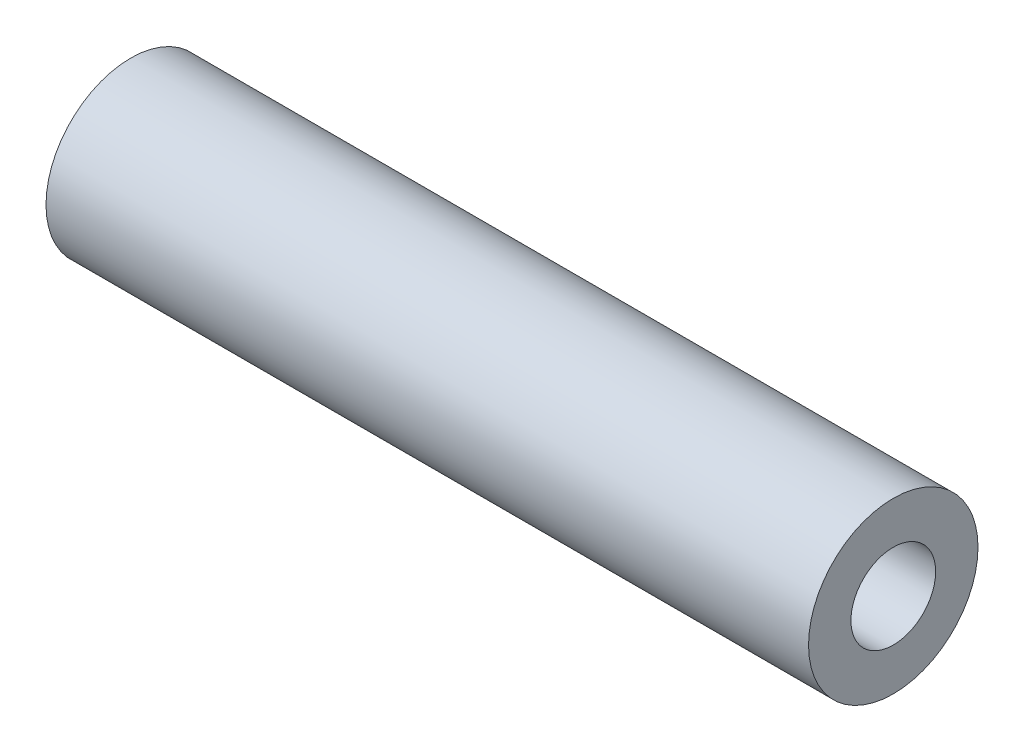
ISO-10303-21;
HEADER;
FILE_DESCRIPTION(('STEP AP214'),'2;1');
FILE_NAME('part.step','',(''),(''),'','','');
FILE_SCHEMA(('AUTOMOTIVE_DESIGN { 1 0 10303 214 1 1 1 1 }'));
ENDSEC;
DATA;
#1=APPLICATION_CONTEXT('core data for automotive mechanical design processes');
#2=APPLICATION_PROTOCOL_DEFINITION('international standard','automotive_design',2000,#1);
#3=PRODUCT_CONTEXT('',#1,'mechanical');
#4=PRODUCT('Part','Part','',(#3));
#5=PRODUCT_RELATED_PRODUCT_CATEGORY('part','',(#4));
#6=PRODUCT_DEFINITION_FORMATION('','',#4);
#7=PRODUCT_DEFINITION_CONTEXT('part definition',#1,'design');
#8=PRODUCT_DEFINITION('design','',#6,#7);
#9=PRODUCT_DEFINITION_SHAPE('','',#8);
#10=(LENGTH_UNIT() NAMED_UNIT(*) SI_UNIT(.MILLI.,.METRE.));
#11=(NAMED_UNIT(*) PLANE_ANGLE_UNIT() SI_UNIT($,.RADIAN.));
#12=(NAMED_UNIT(*) SI_UNIT($,.STERADIAN.) SOLID_ANGLE_UNIT());
#13=UNCERTAINTY_MEASURE_WITH_UNIT(LENGTH_MEASURE(1.E-05),#10,'distance_accuracy_value','');
#14=(GEOMETRIC_REPRESENTATION_CONTEXT(3) GLOBAL_UNCERTAINTY_ASSIGNED_CONTEXT((#13)) GLOBAL_UNIT_ASSIGNED_CONTEXT((#10,
#11,#12)) REPRESENTATION_CONTEXT('',''));
#15=CARTESIAN_POINT('',(0.,0.,0.));
#16=DIRECTION('',(0.,0.,1.));
#17=DIRECTION('',(1.,0.,0.));
#18=AXIS2_PLACEMENT_3D('',#15,#16,#17);
#19=CARTESIAN_POINT('',(114.3,0.,0.));
#20=DIRECTION('',(1.,0.,0.));
#21=DIRECTION('',(0.,0.,-1.));
#22=AXIS2_PLACEMENT_3D('',#19,#20,#21);
#23=PLANE('',#22);
#24=CARTESIAN_POINT('',(114.3,0.,0.));
#25=DIRECTION('',(1.,0.,0.));
#26=DIRECTION('',(0.,0.,-1.));
#27=AXIS2_PLACEMENT_3D('',#24,#25,#26);
#28=CIRCLE('',#27,12.7);
#29=CARTESIAN_POINT('',(114.3,0.,-12.7));
#30=VERTEX_POINT('',#29);
#31=EDGE_CURVE('E10',#30,#30,#28,.T.);
#32=ORIENTED_EDGE('',*,*,#31,.T.);
#33=EDGE_LOOP('',(#32));
#34=FACE_BOUND('',#33,.T.);
#35=CARTESIAN_POINT('',(114.3,0.,0.));
#36=DIRECTION('',(1.,0.,0.));
#37=DIRECTION('',(0.,0.,-1.));
#38=AXIS2_PLACEMENT_3D('',#35,#36,#37);
#39=CIRCLE('',#38,6.35);
#40=CARTESIAN_POINT('',(114.3,0.,-6.35));
#41=VERTEX_POINT('',#40);
#42=EDGE_CURVE('E50',#41,#41,#39,.T.);
#43=ORIENTED_EDGE('',*,*,#42,.F.);
#44=EDGE_LOOP('',(#43));
#45=FACE_BOUND('',#44,.T.);
#46=ADVANCED_FACE('F37',(#34,#45),#23,.T.);
#47=CARTESIAN_POINT('',(0.,0.,0.));
#48=DIRECTION('',(1.,0.,0.));
#49=DIRECTION('',(0.,0.,-1.));
#50=AXIS2_PLACEMENT_3D('',#47,#48,#49);
#51=PLANE('',#50);
#52=CARTESIAN_POINT('',(0.,0.,0.));
#53=DIRECTION('',(1.,0.,0.));
#54=DIRECTION('',(0.,0.,-1.));
#55=AXIS2_PLACEMENT_3D('',#52,#53,#54);
#56=CIRCLE('',#55,12.7);
#57=CARTESIAN_POINT('',(0.,0.,-12.7));
#58=VERTEX_POINT('',#57);
#59=EDGE_CURVE('E41',#58,#58,#56,.T.);
#60=ORIENTED_EDGE('',*,*,#59,.F.);
#61=EDGE_LOOP('',(#60));
#62=FACE_BOUND('',#61,.T.);
#63=CARTESIAN_POINT('',(0.,0.,0.));
#64=DIRECTION('',(1.,0.,0.));
#65=DIRECTION('',(0.,0.,-1.));
#66=AXIS2_PLACEMENT_3D('',#63,#64,#65);
#67=CIRCLE('',#66,6.35);
#68=CARTESIAN_POINT('',(0.,0.,-6.35));
#69=VERTEX_POINT('',#68);
#70=EDGE_CURVE('E52',#69,#69,#67,.T.);
#71=ORIENTED_EDGE('',*,*,#70,.T.);
#72=EDGE_LOOP('',(#71));
#73=FACE_BOUND('',#72,.T.);
#74=ADVANCED_FACE('F64',(#62,#73),#51,.F.);
#75=CARTESIAN_POINT('',(114.3,0.,0.));
#76=DIRECTION('',(-1.,0.,0.));
#77=DIRECTION('',(0.,0.,1.));
#78=AXIS2_PLACEMENT_3D('',#75,#76,#77);
#79=CYLINDRICAL_SURFACE('',#78,12.7);
#80=ORIENTED_EDGE('',*,*,#31,.F.);
#81=EDGE_LOOP('',(#80));
#82=FACE_BOUND('',#81,.T.);
#83=ORIENTED_EDGE('',*,*,#59,.T.);
#84=EDGE_LOOP('',(#83));
#85=FACE_BOUND('',#84,.T.);
#86=ADVANCED_FACE('F39',(#82,#85),#79,.T.);
#87=CARTESIAN_POINT('',(114.3,0.,0.));
#88=DIRECTION('',(-1.,0.,0.));
#89=DIRECTION('',(0.,0.,1.));
#90=AXIS2_PLACEMENT_3D('',#87,#88,#89);
#91=CYLINDRICAL_SURFACE('',#90,6.35);
#92=ORIENTED_EDGE('',*,*,#42,.T.);
#93=EDGE_LOOP('',(#92));
#94=FACE_BOUND('',#93,.T.);
#95=ORIENTED_EDGE('',*,*,#70,.F.);
#96=EDGE_LOOP('',(#95));
#97=FACE_BOUND('',#96,.T.);
#98=ADVANCED_FACE('F60',(#94,#97),#91,.F.);
#99=CLOSED_SHELL('',(#46,#74,#86,#98));
#100=MANIFOLD_SOLID_BREP('B2',#99);
#101=ADVANCED_BREP_SHAPE_REPRESENTATION('',(#18,#100),#14);
#102=SHAPE_DEFINITION_REPRESENTATION(#9,#101);
ENDSEC;
END-ISO-10303-21;
